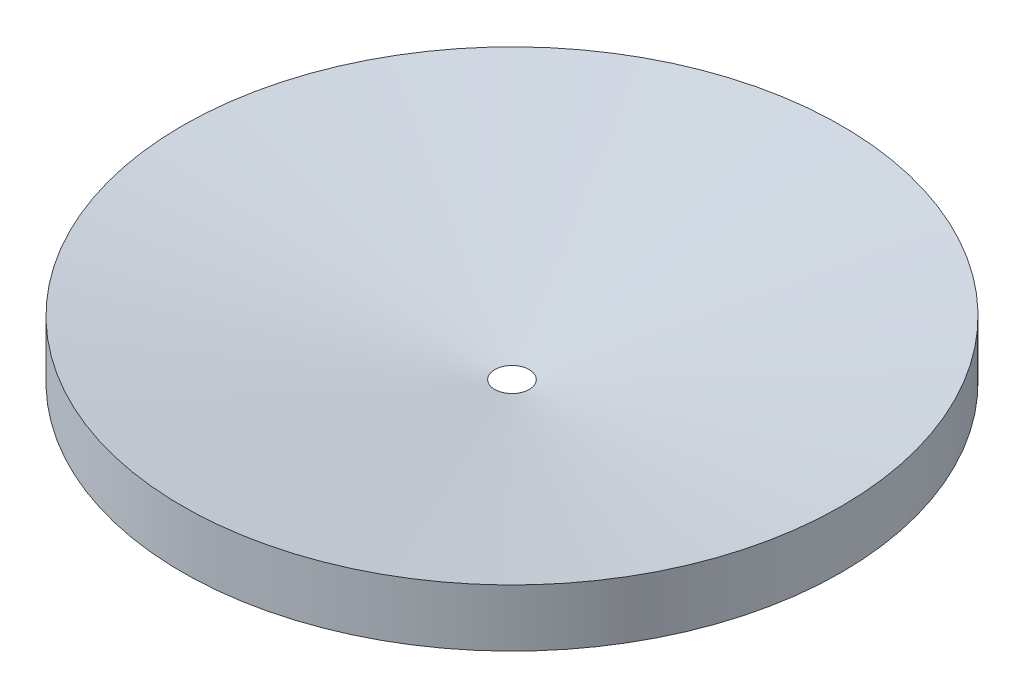
ISO-10303-21;
HEADER;
FILE_DESCRIPTION(('STEP AP214'),'2;1');
FILE_NAME('part.step','',(''),(''),'','','');
FILE_SCHEMA(('AUTOMOTIVE_DESIGN { 1 0 10303 214 1 1 1 1 }'));
ENDSEC;
DATA;
#1=APPLICATION_CONTEXT('core data for automotive mechanical design processes');
#2=APPLICATION_PROTOCOL_DEFINITION('international standard','automotive_design',2000,#1);
#3=PRODUCT_CONTEXT('',#1,'mechanical');
#4=PRODUCT('Part','Part','',(#3));
#5=PRODUCT_RELATED_PRODUCT_CATEGORY('part','',(#4));
#6=PRODUCT_DEFINITION_FORMATION('','',#4);
#7=PRODUCT_DEFINITION_CONTEXT('part definition',#1,'design');
#8=PRODUCT_DEFINITION('design','',#6,#7);
#9=PRODUCT_DEFINITION_SHAPE('','',#8);
#10=(LENGTH_UNIT() NAMED_UNIT(*) SI_UNIT(.MILLI.,.METRE.));
#11=(NAMED_UNIT(*) PLANE_ANGLE_UNIT() SI_UNIT($,.RADIAN.));
#12=(NAMED_UNIT(*) SI_UNIT($,.STERADIAN.) SOLID_ANGLE_UNIT());
#13=UNCERTAINTY_MEASURE_WITH_UNIT(LENGTH_MEASURE(1.E-05),#10,'distance_accuracy_value','');
#14=(GEOMETRIC_REPRESENTATION_CONTEXT(3) GLOBAL_UNCERTAINTY_ASSIGNED_CONTEXT((#13)) GLOBAL_UNIT_ASSIGNED_CONTEXT((#10,
#11,#12)) REPRESENTATION_CONTEXT('',''));
#15=CARTESIAN_POINT('',(0.,0.,0.));
#16=DIRECTION('',(0.,0.,1.));
#17=DIRECTION('',(1.,0.,0.));
#18=AXIS2_PLACEMENT_3D('',#15,#16,#17);
#19=CARTESIAN_POINT('',(0.,10.,0.));
#20=DIRECTION('',(0.,1.,0.));
#21=DIRECTION('',(-1.,0.,0.));
#22=AXIS2_PLACEMENT_3D('',#19,#20,#21);
#23=CYLINDRICAL_SURFACE('',#22,57.5);
#24=CARTESIAN_POINT('',(0.,10.,0.));
#25=DIRECTION('',(0.,1.,0.));
#26=DIRECTION('',(-1.,0.,0.));
#27=AXIS2_PLACEMENT_3D('',#24,#25,#26);
#28=CIRCLE('',#27,57.5);
#29=CARTESIAN_POINT('',(-57.5,10.,0.));
#30=VERTEX_POINT('',#29);
#31=EDGE_CURVE('E53',#30,#30,#28,.T.);
#32=ORIENTED_EDGE('',*,*,#31,.F.);
#33=EDGE_LOOP('',(#32));
#34=FACE_BOUND('',#33,.T.);
#35=CARTESIAN_POINT('',(0.,0.,0.));
#36=DIRECTION('',(0.,1.,0.));
#37=DIRECTION('',(-1.,0.,0.));
#38=AXIS2_PLACEMENT_3D('',#35,#36,#37);
#39=CIRCLE('',#38,57.5);
#40=CARTESIAN_POINT('',(-57.5,0.,0.));
#41=VERTEX_POINT('',#40);
#42=EDGE_CURVE('E10',#41,#41,#39,.T.);
#43=ORIENTED_EDGE('',*,*,#42,.T.);
#44=EDGE_LOOP('',(#43));
#45=FACE_BOUND('',#44,.T.);
#46=ADVANCED_FACE('F31',(#34,#45),#23,.T.);
#47=CARTESIAN_POINT('',(57.5,0.,0.));
#48=DIRECTION('',(0.,1.,0.));
#49=DIRECTION('',(-1.,0.,0.));
#50=AXIS2_PLACEMENT_3D('',#47,#48,#49);
#51=PLANE('',#50);
#52=ORIENTED_EDGE('',*,*,#42,.F.);
#53=EDGE_LOOP('',(#52));
#54=FACE_BOUND('',#53,.T.);
#55=CARTESIAN_POINT('',(0.,0.,0.));
#56=DIRECTION('',(0.,1.,0.));
#57=DIRECTION('',(-1.,0.,0.));
#58=AXIS2_PLACEMENT_3D('',#55,#56,#57);
#59=CIRCLE('',#58,56.);
#60=CARTESIAN_POINT('',(-56.,0.,0.));
#61=VERTEX_POINT('',#60);
#62=EDGE_CURVE('E37',#61,#61,#59,.T.);
#63=ORIENTED_EDGE('',*,*,#62,.T.);
#64=EDGE_LOOP('',(#63));
#65=FACE_BOUND('',#64,.T.);
#66=ADVANCED_FACE('F60',(#54,#65),#51,.F.);
#67=CARTESIAN_POINT('',(0.,10.,0.));
#68=DIRECTION('',(0.,1.,0.));
#69=DIRECTION('',(-1.,0.,0.));
#70=AXIS2_PLACEMENT_3D('',#67,#68,#69);
#71=CYLINDRICAL_SURFACE('',#70,56.);
#72=ORIENTED_EDGE('',*,*,#62,.F.);
#73=EDGE_LOOP('',(#72));
#74=FACE_BOUND('',#73,.T.);
#75=CARTESIAN_POINT('',(0.,9.22779622299446,0.));
#76=DIRECTION('',(0.,1.,0.));
#77=DIRECTION('',(-1.,0.,0.));
#78=AXIS2_PLACEMENT_3D('',#75,#76,#77);
#79=CIRCLE('',#78,56.);
#80=CARTESIAN_POINT('',(-56.,9.22779622299446,0.));
#81=VERTEX_POINT('',#80);
#82=EDGE_CURVE('E41',#81,#81,#79,.T.);
#83=ORIENTED_EDGE('',*,*,#82,.T.);
#84=EDGE_LOOP('',(#83));
#85=FACE_BOUND('',#84,.T.);
#86=ADVANCED_FACE('F64',(#74,#85),#71,.F.);
#87=CARTESIAN_POINT('',(0.,0.390179551389053,0.));
#88=DIRECTION('',(0.,1.,0.));
#89=DIRECTION('',(-1.,0.,0.));
#90=AXIS2_PLACEMENT_3D('',#87,#88,#89);
#91=CONICAL_SURFACE('',#90,5.87938524157193,1.39626340159547);
#92=CARTESIAN_POINT('',(0.,0.390179551389053,0.));
#93=DIRECTION('',(0.,1.,0.));
#94=DIRECTION('',(-1.,0.,0.));
#95=AXIS2_PLACEMENT_3D('',#92,#93,#94);
#96=CIRCLE('',#95,5.87938524157193);
#97=CARTESIAN_POINT('',(-5.87938524157193,0.390179551389053,0.));
#98=VERTEX_POINT('',#97);
#99=EDGE_CURVE('E45',#98,#98,#96,.T.);
#100=CARTESIAN_POINT('',(-56.,9.22779622299446,0.));
#101=CARTESIAN_POINT('',(-55.477910262933,9.13573771599857,0.));
#102=CARTESIAN_POINT('',(-54.9558205258661,9.04367920900268,0.));
#103=CARTESIAN_POINT('',(-53.9116410517321,8.8595621950109,0.));
#104=CARTESIAN_POINT('',(-53.3895513146652,8.76750368801501,0.));
#105=CARTESIAN_POINT('',(-52.3453718405313,8.58338667402323,0.));
#106=CARTESIAN_POINT('',(-51.8232821034643,8.49132816702734,0.));
#107=CARTESIAN_POINT('',(-50.7791026293304,8.30721115303556,0.));
#108=CARTESIAN_POINT('',(-50.2570128922634,8.21515264603967,0.));
#109=CARTESIAN_POINT('',(-49.2128334181295,8.03103563204789,0.));
#110=CARTESIAN_POINT('',(-48.6907436810626,7.938977125052,0.));
#111=CARTESIAN_POINT('',(-47.6465642069286,7.75486011106022,0.));
#112=CARTESIAN_POINT('',(-47.1244744698617,7.66280160406434,0.));
#113=CARTESIAN_POINT('',(-46.0802949957277,7.47868459007256,0.));
#114=CARTESIAN_POINT('',(-45.5582052586608,7.38662608307667,0.));
#115=CARTESIAN_POINT('',(-44.5140257845269,7.20250906908489,0.));
#116=CARTESIAN_POINT('',(-43.9919360474599,7.110450562089,0.));
#117=CARTESIAN_POINT('',(-42.947756573326,6.92633354809722,0.));
#118=CARTESIAN_POINT('',(-42.4256668362591,6.83427504110133,0.));
#119=CARTESIAN_POINT('',(-41.3814873621251,6.65015802710955,0.));
#120=CARTESIAN_POINT('',(-40.8593976250582,6.55809952011366,0.));
#121=CARTESIAN_POINT('',(-39.8152181509243,6.37398250612188,0.));
#122=CARTESIAN_POINT('',(-39.2931284138573,6.28192399912599,0.));
#123=CARTESIAN_POINT('',(-38.2489489397234,6.09780698513421,0.));
#124=CARTESIAN_POINT('',(-37.7268592026564,6.00574847813832,0.));
#125=CARTESIAN_POINT('',(-36.6826797285225,5.82163146414654,0.));
#126=CARTESIAN_POINT('',(-36.1605899914555,5.72957295715065,0.));
#127=CARTESIAN_POINT('',(-35.1164105173216,5.54545594315887,0.));
#128=CARTESIAN_POINT('',(-34.5943207802547,5.45339743616298,0.));
#129=CARTESIAN_POINT('',(-33.5501413061207,5.2692804221712,0.));
#130=CARTESIAN_POINT('',(-33.0280515690538,5.17722191517532,0.));
#131=CARTESIAN_POINT('',(-31.9838720949199,4.99310490118354,0.));
#132=CARTESIAN_POINT('',(-31.4617823578529,4.90104639418765,0.));
#133=CARTESIAN_POINT('',(-30.417602883719,4.71692938019587,0.));
#134=CARTESIAN_POINT('',(-29.895513146652,4.62487087319998,0.));
#135=CARTESIAN_POINT('',(-28.8513336725181,4.4407538592082,0.));
#136=CARTESIAN_POINT('',(-28.3292439354512,4.34869535221231,0.));
#137=CARTESIAN_POINT('',(-27.2850644613172,4.16457833822053,0.));
#138=CARTESIAN_POINT('',(-26.7629747242503,4.07251983122464,0.));
#139=CARTESIAN_POINT('',(-25.7187952501164,3.88840281723286,0.));
#140=CARTESIAN_POINT('',(-25.1967055130494,3.79634431023697,0.));
#141=CARTESIAN_POINT('',(-24.1525260389155,3.61222729624519,0.));
#142=CARTESIAN_POINT('',(-23.6304363018485,3.5201687892493,0.));
#143=CARTESIAN_POINT('',(-22.5862568277146,3.33605177525752,0.));
#144=CARTESIAN_POINT('',(-22.0641670906477,3.24399326826163,0.));
#145=CARTESIAN_POINT('',(-21.0199876165137,3.05987625426985,0.));
#146=CARTESIAN_POINT('',(-20.4978978794468,2.96781774727396,0.));
#147=CARTESIAN_POINT('',(-19.4537184053129,2.78370073328218,0.));
#148=CARTESIAN_POINT('',(-18.9316286682459,2.69164222628629,0.));
#149=CARTESIAN_POINT('',(-17.887449194112,2.50752521229452,0.));
#150=CARTESIAN_POINT('',(-17.365359457045,2.41546670529863,0.));
#151=CARTESIAN_POINT('',(-16.3211799829111,2.23134969130685,0.));
#152=CARTESIAN_POINT('',(-15.7990902458442,2.13929118431096,0.));
#153=CARTESIAN_POINT('',(-14.7549107717102,1.95517417031918,0.));
#154=CARTESIAN_POINT('',(-14.2328210346433,1.86311566332329,0.));
#155=CARTESIAN_POINT('',(-13.1886415605094,1.67899864933151,0.));
#156=CARTESIAN_POINT('',(-12.6665518234424,1.58694014233562,0.));
#157=CARTESIAN_POINT('',(-11.6223723493085,1.40282312834384,0.));
#158=CARTESIAN_POINT('',(-11.1002826122415,1.31076462134795,0.));
#159=CARTESIAN_POINT('',(-10.0561031381076,1.12664760735617,0.));
#160=CARTESIAN_POINT('',(-9.53401340104064,1.03458910036028,0.));
#161=CARTESIAN_POINT('',(-8.48983392690673,0.850472086368502,0.));
#162=CARTESIAN_POINT('',(-7.96774418983977,0.758413579372612,0.));
#163=CARTESIAN_POINT('',(-6.92356471570585,0.574296565380833,0.));
#164=CARTESIAN_POINT('',(-6.40147497863889,0.482238058384943,0.));
#165=CARTESIAN_POINT('',(-5.87938524157193,0.390179551389053,0.));
#166=B_SPLINE_CURVE_WITH_KNOTS('',3,(#100,#101,#102,#103,#104,#105,#106,#107,#108,#109,#110,
#111,#112,#113,#114,#115,#116,#117,#118,#119,#120,#121,#122,#123,#124,#125,#126,#127,#128,#129,
#130,#131,#132,#133,#134,#135,#136,#137,#138,#139,#140,#141,#142,#143,#144,#145,#146,#147,#148,
#149,#150,#151,#152,#153,#154,#155,#156,#157,#158,#159,#160,#161,#162,#163,#164,#165),
.UNSPECIFIED.,.F.,.F.,(4,2,2,2,2,2,2,2,2,2,2,2,2,2,2,2,2,2,2,2,2,2,2,2,2,2,2,2,2,2,2,2,4),(0.,
1.59043143843067,3.18086287686133,4.771294315292,6.36172575372266,7.95215719215331,
9.54258863058399,11.1330200690146,12.7234515074453,14.313882945876,15.9043143843066,
17.4947458227373,19.085177261168,20.6756086995986,22.2660401380293,23.8564715764599,
25.4469030148906,27.0373344533213,28.6277658917519,30.2181973301826,31.8086287686132,
33.3990602070439,34.9894916454746,36.5799230839052,38.1703545223359,39.7607859607666,
41.3512173991972,42.9416488376279,44.5320802760586,46.1225117144892,47.7129431529199,
49.3033745913505,50.8938060297812),.UNSPECIFIED.);
#167=EDGE_CURVE('BSEAM69',#81,#98,#166,.T.);
#168=ORIENTED_EDGE('',*,*,#82,.F.);
#169=ORIENTED_EDGE('',*,*,#99,.T.);
#170=ORIENTED_EDGE('',*,*,#167,.T.);
#171=ORIENTED_EDGE('',*,*,#167,.F.);
#172=EDGE_LOOP('',(#168,#170,#169,#171));
#173=FACE_BOUND('',#172,.T.);
#174=ADVANCED_FACE('F69',(#173),#91,.T.);
#175=CARTESIAN_POINT('',(3.,0.390179551389053,0.));
#176=DIRECTION('',(0.,1.,0.));
#177=DIRECTION('',(-1.,0.,0.));
#178=AXIS2_PLACEMENT_3D('',#175,#176,#177);
#179=PLANE('',#178);
#180=ORIENTED_EDGE('',*,*,#99,.F.);
#181=EDGE_LOOP('',(#180));
#182=FACE_BOUND('',#181,.T.);
#183=CARTESIAN_POINT('',(0.,0.390179551389053,0.));
#184=DIRECTION('',(0.,1.,0.));
#185=DIRECTION('',(-1.,0.,0.));
#186=AXIS2_PLACEMENT_3D('',#183,#184,#185);
#187=CIRCLE('',#186,3.);
#188=CARTESIAN_POINT('',(-2.99999999999998,0.390179551389052,0.));
#189=VERTEX_POINT('',#188);
#190=EDGE_CURVE('E50',#189,#189,#187,.T.);
#191=ORIENTED_EDGE('',*,*,#190,.T.);
#192=EDGE_LOOP('',(#191));
#193=FACE_BOUND('',#192,.T.);
#194=ADVANCED_FACE('F75',(#182,#193),#179,.F.);
#195=CARTESIAN_POINT('',(0.,10.,0.));
#196=DIRECTION('',(0.,1.,0.));
#197=DIRECTION('',(-1.,0.,0.));
#198=AXIS2_PLACEMENT_3D('',#195,#196,#197);
#199=CONICAL_SURFACE('',#198,57.5,1.39626340159547);
#200=CARTESIAN_POINT('',(-2.99999999999998,0.390179551389052,0.));
#201=CARTESIAN_POINT('',(-3.56770833333331,0.490281847728749,0.));
#202=CARTESIAN_POINT('',(-4.13541666666665,0.590384144068447,0.));
#203=CARTESIAN_POINT('',(-5.27083333333332,0.790588736747842,0.));
#204=CARTESIAN_POINT('',(-5.83854166666665,0.89069103308754,0.));
#205=CARTESIAN_POINT('',(-6.97395833333331,1.09089562576693,0.));
#206=CARTESIAN_POINT('',(-7.54166666666664,1.19099792210663,0.));
#207=CARTESIAN_POINT('',(-8.67708333333331,1.39120251478603,0.));
#208=CARTESIAN_POINT('',(-9.24479166666664,1.49130481112572,0.));
#209=CARTESIAN_POINT('',(-10.3802083333333,1.69150940380512,0.));
#210=CARTESIAN_POINT('',(-10.9479166666666,1.79161170014482,0.));
#211=CARTESIAN_POINT('',(-12.0833333333333,1.99181629282421,0.));
#212=CARTESIAN_POINT('',(-12.6510416666666,2.09191858916391,0.));
#213=CARTESIAN_POINT('',(-13.7864583333333,2.29212318184331,0.));
#214=CARTESIAN_POINT('',(-14.3541666666667,2.392225478183,0.));
#215=CARTESIAN_POINT('',(-15.4895833333333,2.5924300708624,0.));
#216=CARTESIAN_POINT('',(-16.0572916666667,2.6925323672021,0.));
#217=CARTESIAN_POINT('',(-17.1927083333333,2.89273695988149,0.));
#218=CARTESIAN_POINT('',(-17.7604166666666,2.99283925622119,0.));
#219=CARTESIAN_POINT('',(-18.8958333333333,3.19304384890058,0.));
#220=CARTESIAN_POINT('',(-19.4635416666666,3.29314614524028,0.));
#221=CARTESIAN_POINT('',(-20.5989583333333,3.49335073791968,0.));
#222=CARTESIAN_POINT('',(-21.1666666666667,3.59345303425937,0.));
#223=CARTESIAN_POINT('',(-22.3020833333333,3.79365762693877,0.));
#224=CARTESIAN_POINT('',(-22.8697916666667,3.89375992327847,0.));
#225=CARTESIAN_POINT('',(-24.0052083333333,4.09396451595786,0.));
#226=CARTESIAN_POINT('',(-24.5729166666667,4.19406681229756,0.));
#227=CARTESIAN_POINT('',(-25.7083333333333,4.39427140497695,0.));
#228=CARTESIAN_POINT('',(-26.2760416666667,4.49437370131665,0.));
#229=CARTESIAN_POINT('',(-27.4114583333333,4.69457829399605,0.));
#230=CARTESIAN_POINT('',(-27.9791666666667,4.79468059033574,0.));
#231=CARTESIAN_POINT('',(-29.1145833333333,4.99488518301514,0.));
#232=CARTESIAN_POINT('',(-29.6822916666667,5.09498747935483,0.));
#233=CARTESIAN_POINT('',(-30.8177083333333,5.29519207203423,0.));
#234=CARTESIAN_POINT('',(-31.3854166666667,5.39529436837393,0.));
#235=CARTESIAN_POINT('',(-32.5208333333333,5.59549896105332,0.));
#236=CARTESIAN_POINT('',(-33.0885416666667,5.69560125739302,0.));
#237=CARTESIAN_POINT('',(-34.2239583333333,5.89580585007242,0.));
#238=CARTESIAN_POINT('',(-34.7916666666667,5.99590814641211,0.));
#239=CARTESIAN_POINT('',(-35.9270833333333,6.19611273909151,0.));
#240=CARTESIAN_POINT('',(-36.4947916666667,6.2962150354312,0.));
#241=CARTESIAN_POINT('',(-37.6302083333333,6.4964196281106,0.));
#242=CARTESIAN_POINT('',(-38.1979166666667,6.5965219244503,0.));
#243=CARTESIAN_POINT('',(-39.3333333333333,6.79672651712969,0.));
#244=CARTESIAN_POINT('',(-39.9010416666667,6.89682881346939,0.));
#245=CARTESIAN_POINT('',(-41.0364583333333,7.09703340614879,0.));
#246=CARTESIAN_POINT('',(-41.6041666666667,7.19713570248848,0.));
#247=CARTESIAN_POINT('',(-42.7395833333333,7.39734029516788,0.));
#248=CARTESIAN_POINT('',(-43.3072916666667,7.49744259150758,0.));
#249=CARTESIAN_POINT('',(-44.4427083333333,7.69764718418697,0.));
#250=CARTESIAN_POINT('',(-45.0104166666667,7.79774948052667,0.));
#251=CARTESIAN_POINT('',(-46.1458333333333,7.99795407320606,0.));
#252=CARTESIAN_POINT('',(-46.7135416666667,8.09805636954576,0.));
#253=CARTESIAN_POINT('',(-47.8489583333333,8.29826096222516,0.));
#254=CARTESIAN_POINT('',(-48.4166666666667,8.39836325856485,0.));
#255=CARTESIAN_POINT('',(-49.5520833333333,8.59856785124425,0.));
#256=CARTESIAN_POINT('',(-50.1197916666667,8.69867014758395,0.));
#257=CARTESIAN_POINT('',(-51.2552083333333,8.89887474026334,0.));
#258=CARTESIAN_POINT('',(-51.8229166666667,8.99897703660304,0.));
#259=CARTESIAN_POINT('',(-52.9583333333333,9.19918162928243,0.));
#260=CARTESIAN_POINT('',(-53.5260416666667,9.29928392562213,0.));
#261=CARTESIAN_POINT('',(-54.6614583333333,9.49948851830153,0.));
#262=CARTESIAN_POINT('',(-55.2291666666667,9.59959081464122,0.));
#263=CARTESIAN_POINT('',(-56.3645833333333,9.79979540732062,0.));
#264=CARTESIAN_POINT('',(-56.9322916666667,9.89989770366032,0.));
#265=CARTESIAN_POINT('',(-57.5,10.,0.));
#266=B_SPLINE_CURVE_WITH_KNOTS('',3,(#200,#201,#202,#203,#204,#205,#206,#207,#208,#209,#210,
#211,#212,#213,#214,#215,#216,#217,#218,#219,#220,#221,#222,#223,#224,#225,#226,#227,#228,#229,
#230,#231,#232,#233,#234,#235,#236,#237,#238,#239,#240,#241,#242,#243,#244,#245,#246,#247,#248,
#249,#250,#251,#252,#253,#254,#255,#256,#257,#258,#259,#260,#261,#262,#263,#264,#265),
.UNSPECIFIED.,.F.,.F.,(4,2,2,2,2,2,2,2,2,2,2,2,2,2,2,2,2,2,2,2,2,2,2,2,2,2,2,2,2,2,2,2,4),(0.,
1.72939844836791,3.45879689673582,5.18819534510372,6.91759379347163,8.64699224183954,
10.3763906902074,12.1057891385754,13.8351875869433,15.5645860353112,17.2939844836791,
19.023382932047,20.7527813804149,22.4821798287828,24.2115782771507,25.9409767255186,
27.6703751738865,29.3997736222545,31.1291720706224,32.8585705189903,34.5879689673582,
36.3173674157261,38.046765864094,39.7761643124619,41.5055627608298,43.2349612091977,
44.9643596575656,46.6937581059335,48.4231565543014,50.1525550026693,51.8819534510372,
53.6113518994051,55.340750347773),.UNSPECIFIED.);
#267=EDGE_CURVE('BSEAM57',#189,#30,#266,.T.);
#268=ORIENTED_EDGE('',*,*,#190,.F.);
#269=ORIENTED_EDGE('',*,*,#31,.T.);
#270=ORIENTED_EDGE('',*,*,#267,.T.);
#271=ORIENTED_EDGE('',*,*,#267,.F.);
#272=EDGE_LOOP('',(#268,#270,#269,#271));
#273=FACE_BOUND('',#272,.T.);
#274=ADVANCED_FACE('F57',(#273),#199,.F.);
#275=CLOSED_SHELL('',(#46,#66,#86,#174,#194,#274));
#276=MANIFOLD_SOLID_BREP('B2',#275);
#277=ADVANCED_BREP_SHAPE_REPRESENTATION('',(#18,#276),#14);
#278=SHAPE_DEFINITION_REPRESENTATION(#9,#277);
ENDSEC;
END-ISO-10303-21;
